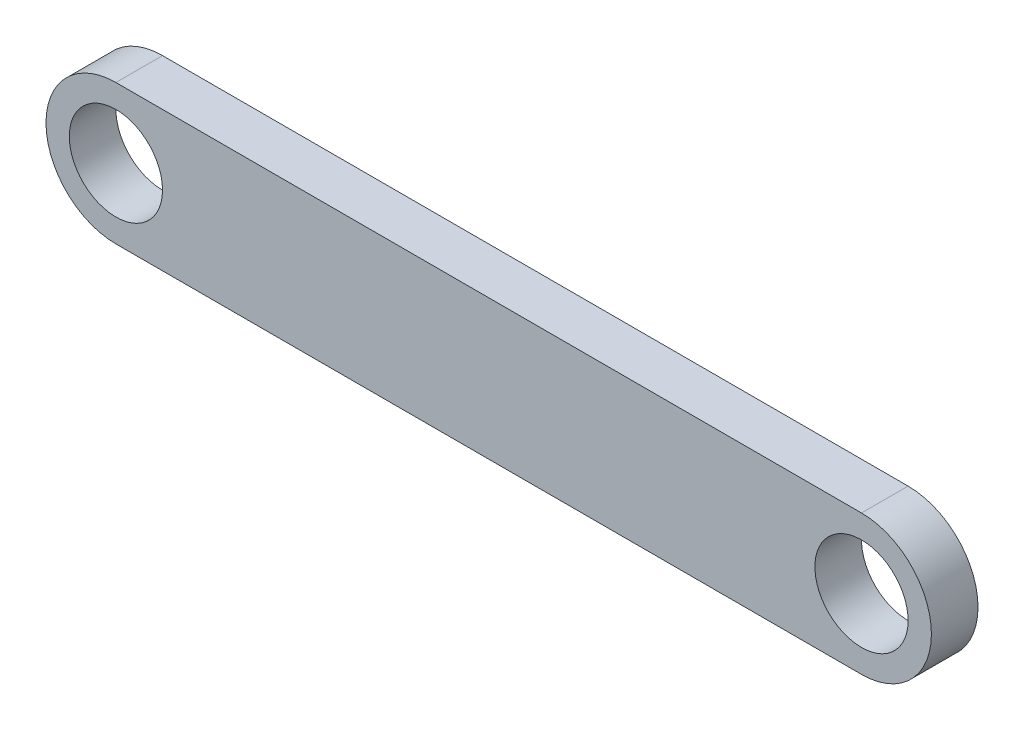
ISO-10303-21;
HEADER;
FILE_DESCRIPTION(('STEP AP214'),'2;1');
FILE_NAME('part.step','',(''),(''),'','','');
FILE_SCHEMA(('AUTOMOTIVE_DESIGN { 1 0 10303 214 1 1 1 1 }'));
ENDSEC;
DATA;
#1=APPLICATION_CONTEXT('core data for automotive mechanical design processes');
#2=APPLICATION_PROTOCOL_DEFINITION('international standard','automotive_design',2000,#1);
#3=PRODUCT_CONTEXT('',#1,'mechanical');
#4=PRODUCT('Part','Part','',(#3));
#5=PRODUCT_RELATED_PRODUCT_CATEGORY('part','',(#4));
#6=PRODUCT_DEFINITION_FORMATION('','',#4);
#7=PRODUCT_DEFINITION_CONTEXT('part definition',#1,'design');
#8=PRODUCT_DEFINITION('design','',#6,#7);
#9=PRODUCT_DEFINITION_SHAPE('','',#8);
#10=(LENGTH_UNIT() NAMED_UNIT(*) SI_UNIT(.MILLI.,.METRE.));
#11=(NAMED_UNIT(*) PLANE_ANGLE_UNIT() SI_UNIT($,.RADIAN.));
#12=(NAMED_UNIT(*) SI_UNIT($,.STERADIAN.) SOLID_ANGLE_UNIT());
#13=UNCERTAINTY_MEASURE_WITH_UNIT(LENGTH_MEASURE(1.E-05),#10,'distance_accuracy_value','');
#14=(GEOMETRIC_REPRESENTATION_CONTEXT(3) GLOBAL_UNCERTAINTY_ASSIGNED_CONTEXT((#13)) GLOBAL_UNIT_ASSIGNED_CONTEXT((#10,
#11,#12)) REPRESENTATION_CONTEXT('',''));
#15=CARTESIAN_POINT('',(0.,0.,0.));
#16=DIRECTION('',(0.,0.,1.));
#17=DIRECTION('',(1.,0.,0.));
#18=AXIS2_PLACEMENT_3D('',#15,#16,#17);
#19=CARTESIAN_POINT('',(0.,0.,10.));
#20=DIRECTION('',(0.,0.,1.));
#21=DIRECTION('',(1.,0.,0.));
#22=AXIS2_PLACEMENT_3D('',#19,#20,#21);
#23=PLANE('',#22);
#24=CARTESIAN_POINT('',(0.,0.,10.));
#25=DIRECTION('',(0.,0.,1.));
#26=DIRECTION('',(1.,0.,0.));
#27=AXIS2_PLACEMENT_3D('',#24,#25,#26);
#28=CIRCLE('',#27,10.);
#29=CARTESIAN_POINT('',(10.,0.,10.));
#30=VERTEX_POINT('',#29);
#31=EDGE_CURVE('E118',#30,#30,#28,.T.);
#32=ORIENTED_EDGE('',*,*,#31,.F.);
#33=EDGE_LOOP('',(#32));
#34=FACE_BOUND('',#33,.T.);
#35=CARTESIAN_POINT('',(0.,0.,10.));
#36=DIRECTION('',(0.,0.,1.));
#37=DIRECTION('',(1.,0.,0.));
#38=AXIS2_PLACEMENT_3D('',#35,#36,#37);
#39=CIRCLE('',#38,15.);
#40=CARTESIAN_POINT('',(0.,15.,10.));
#41=VERTEX_POINT('',#40);
#42=CARTESIAN_POINT('',(0.,-15.,10.));
#43=VERTEX_POINT('',#42);
#44=EDGE_CURVE('E98',#41,#43,#39,.T.);
#45=ORIENTED_EDGE('',*,*,#44,.T.);
#46=DIRECTION('',(1.,0.,0.));
#47=VECTOR('',#46,1.);
#48=CARTESIAN_POINT('',(0.,-15.,10.));
#49=LINE('',#48,#47);
#50=CARTESIAN_POINT('',(160.,-15.,10.));
#51=VERTEX_POINT('',#50);
#52=EDGE_CURVE('E93',#43,#51,#49,.T.);
#53=ORIENTED_EDGE('',*,*,#52,.T.);
#54=CARTESIAN_POINT('',(160.,0.,10.));
#55=DIRECTION('',(0.,0.,1.));
#56=DIRECTION('',(1.,0.,0.));
#57=AXIS2_PLACEMENT_3D('',#54,#55,#56);
#58=CIRCLE('',#57,15.);
#59=CARTESIAN_POINT('',(160.,15.,10.));
#60=VERTEX_POINT('',#59);
#61=EDGE_CURVE('E96',#51,#60,#58,.T.);
#62=ORIENTED_EDGE('',*,*,#61,.T.);
#63=DIRECTION('',(-1.,0.,0.));
#64=VECTOR('',#63,1.);
#65=CARTESIAN_POINT('',(0.,15.,10.));
#66=LINE('',#65,#64);
#67=EDGE_CURVE('E63',#60,#41,#66,.T.);
#68=ORIENTED_EDGE('',*,*,#67,.T.);
#69=EDGE_LOOP('',(#45,#53,#62,#68));
#70=FACE_BOUND('',#69,.T.);
#71=CARTESIAN_POINT('',(160.,0.,10.));
#72=DIRECTION('',(0.,0.,1.));
#73=DIRECTION('',(1.,0.,0.));
#74=AXIS2_PLACEMENT_3D('',#71,#72,#73);
#75=CIRCLE('',#74,10.);
#76=CARTESIAN_POINT('',(170.,0.,10.));
#77=VERTEX_POINT('',#76);
#78=EDGE_CURVE('E140',#77,#77,#75,.T.);
#79=ORIENTED_EDGE('',*,*,#78,.F.);
#80=EDGE_LOOP('',(#79));
#81=FACE_BOUND('',#80,.T.);
#82=ADVANCED_FACE('F45',(#34,#70,#81),#23,.T.);
#83=CARTESIAN_POINT('',(0.,0.,0.));
#84=DIRECTION('',(0.,0.,1.));
#85=DIRECTION('',(1.,0.,0.));
#86=AXIS2_PLACEMENT_3D('',#83,#84,#85);
#87=PLANE('',#86);
#88=CARTESIAN_POINT('',(0.,0.,0.));
#89=DIRECTION('',(0.,0.,1.));
#90=DIRECTION('',(1.,0.,0.));
#91=AXIS2_PLACEMENT_3D('',#88,#89,#90);
#92=CIRCLE('',#91,15.);
#93=CARTESIAN_POINT('',(0.,15.,0.));
#94=VERTEX_POINT('',#93);
#95=CARTESIAN_POINT('',(0.,-15.,0.));
#96=VERTEX_POINT('',#95);
#97=EDGE_CURVE('E114',#94,#96,#92,.T.);
#98=ORIENTED_EDGE('',*,*,#97,.F.);
#99=DIRECTION('',(-1.,0.,0.));
#100=VECTOR('',#99,1.);
#101=CARTESIAN_POINT('',(0.,15.,0.));
#102=LINE('',#101,#100);
#103=CARTESIAN_POINT('',(160.,15.,0.));
#104=VERTEX_POINT('',#103);
#105=EDGE_CURVE('E86',#104,#94,#102,.T.);
#106=ORIENTED_EDGE('',*,*,#105,.F.);
#107=CARTESIAN_POINT('',(160.,0.,0.));
#108=DIRECTION('',(0.,0.,1.));
#109=DIRECTION('',(1.,0.,0.));
#110=AXIS2_PLACEMENT_3D('',#107,#108,#109);
#111=CIRCLE('',#110,15.);
#112=CARTESIAN_POINT('',(160.,-15.,0.));
#113=VERTEX_POINT('',#112);
#114=EDGE_CURVE('E80',#113,#104,#111,.T.);
#115=ORIENTED_EDGE('',*,*,#114,.F.);
#116=DIRECTION('',(1.,0.,0.));
#117=VECTOR('',#116,1.);
#118=CARTESIAN_POINT('',(0.,-15.,0.));
#119=LINE('',#118,#117);
#120=EDGE_CURVE('E103',#96,#113,#119,.T.);
#121=ORIENTED_EDGE('',*,*,#120,.F.);
#122=EDGE_LOOP('',(#98,#106,#115,#121));
#123=FACE_BOUND('',#122,.T.);
#124=CARTESIAN_POINT('',(0.,0.,0.));
#125=DIRECTION('',(0.,0.,1.));
#126=DIRECTION('',(1.,0.,0.));
#127=AXIS2_PLACEMENT_3D('',#124,#125,#126);
#128=CIRCLE('',#127,10.);
#129=CARTESIAN_POINT('',(10.,0.,0.));
#130=VERTEX_POINT('',#129);
#131=EDGE_CURVE('E136',#130,#130,#128,.T.);
#132=ORIENTED_EDGE('',*,*,#131,.T.);
#133=EDGE_LOOP('',(#132));
#134=FACE_BOUND('',#133,.T.);
#135=CARTESIAN_POINT('',(160.,0.,0.));
#136=DIRECTION('',(0.,0.,1.));
#137=DIRECTION('',(1.,0.,0.));
#138=AXIS2_PLACEMENT_3D('',#135,#136,#137);
#139=CIRCLE('',#138,10.);
#140=CARTESIAN_POINT('',(170.,0.,0.));
#141=VERTEX_POINT('',#140);
#142=EDGE_CURVE('E144',#141,#141,#139,.T.);
#143=ORIENTED_EDGE('',*,*,#142,.T.);
#144=EDGE_LOOP('',(#143));
#145=FACE_BOUND('',#144,.T.);
#146=ADVANCED_FACE('F131',(#123,#134,#145),#87,.F.);
#147=CARTESIAN_POINT('',(0.,0.,10.));
#148=DIRECTION('',(0.,0.,-1.));
#149=DIRECTION('',(-1.,0.,0.));
#150=AXIS2_PLACEMENT_3D('',#147,#148,#149);
#151=CYLINDRICAL_SURFACE('',#150,15.);
#152=ORIENTED_EDGE('',*,*,#97,.T.);
#153=DIRECTION('',(0.,0.,-1.));
#154=VECTOR('',#153,1.);
#155=CARTESIAN_POINT('',(0.,-15.,10.));
#156=LINE('',#155,#154);
#157=EDGE_CURVE('E11',#43,#96,#156,.T.);
#158=ORIENTED_EDGE('',*,*,#157,.F.);
#159=ORIENTED_EDGE('',*,*,#44,.F.);
#160=DIRECTION('',(0.,0.,-1.));
#161=VECTOR('',#160,1.);
#162=CARTESIAN_POINT('',(0.,15.,10.));
#163=LINE('',#162,#161);
#164=EDGE_CURVE('E110',#41,#94,#163,.T.);
#165=ORIENTED_EDGE('',*,*,#164,.T.);
#166=EDGE_LOOP('',(#152,#158,#159,#165));
#167=FACE_BOUND('',#166,.T.);
#168=ADVANCED_FACE('F47',(#167),#151,.T.);
#169=CARTESIAN_POINT('',(0.,-15.,10.));
#170=DIRECTION('',(0.,1.,0.));
#171=DIRECTION('',(0.,0.,1.));
#172=AXIS2_PLACEMENT_3D('',#169,#170,#171);
#173=PLANE('',#172);
#174=ORIENTED_EDGE('',*,*,#120,.T.);
#175=DIRECTION('',(0.,0.,-1.));
#176=VECTOR('',#175,1.);
#177=CARTESIAN_POINT('',(160.,-15.,10.));
#178=LINE('',#177,#176);
#179=EDGE_CURVE('E55',#51,#113,#178,.T.);
#180=ORIENTED_EDGE('',*,*,#179,.F.);
#181=ORIENTED_EDGE('',*,*,#52,.F.);
#182=ORIENTED_EDGE('',*,*,#157,.T.);
#183=EDGE_LOOP('',(#174,#180,#181,#182));
#184=FACE_BOUND('',#183,.T.);
#185=ADVANCED_FACE('F102',(#184),#173,.F.);
#186=CARTESIAN_POINT('',(160.,0.,10.));
#187=DIRECTION('',(0.,0.,-1.));
#188=DIRECTION('',(-1.,0.,0.));
#189=AXIS2_PLACEMENT_3D('',#186,#187,#188);
#190=CYLINDRICAL_SURFACE('',#189,15.);
#191=ORIENTED_EDGE('',*,*,#114,.T.);
#192=DIRECTION('',(0.,0.,-1.));
#193=VECTOR('',#192,1.);
#194=CARTESIAN_POINT('',(160.,15.,10.));
#195=LINE('',#194,#193);
#196=EDGE_CURVE('E105',#60,#104,#195,.T.);
#197=ORIENTED_EDGE('',*,*,#196,.F.);
#198=ORIENTED_EDGE('',*,*,#61,.F.);
#199=ORIENTED_EDGE('',*,*,#179,.T.);
#200=EDGE_LOOP('',(#191,#197,#198,#199));
#201=FACE_BOUND('',#200,.T.);
#202=ADVANCED_FACE('F106',(#201),#190,.T.);
#203=CARTESIAN_POINT('',(0.,15.,10.));
#204=DIRECTION('',(0.,-1.,0.));
#205=DIRECTION('',(0.,0.,-1.));
#206=AXIS2_PLACEMENT_3D('',#203,#204,#205);
#207=PLANE('',#206);
#208=ORIENTED_EDGE('',*,*,#105,.T.);
#209=ORIENTED_EDGE('',*,*,#164,.F.);
#210=ORIENTED_EDGE('',*,*,#67,.F.);
#211=ORIENTED_EDGE('',*,*,#196,.T.);
#212=EDGE_LOOP('',(#208,#209,#210,#211));
#213=FACE_BOUND('',#212,.T.);
#214=ADVANCED_FACE('F128',(#213),#207,.F.);
#215=CARTESIAN_POINT('',(0.,0.,10.));
#216=DIRECTION('',(0.,0.,-1.));
#217=DIRECTION('',(-1.,0.,0.));
#218=AXIS2_PLACEMENT_3D('',#215,#216,#217);
#219=CYLINDRICAL_SURFACE('',#218,10.);
#220=ORIENTED_EDGE('',*,*,#31,.T.);
#221=EDGE_LOOP('',(#220));
#222=FACE_BOUND('',#221,.T.);
#223=ORIENTED_EDGE('',*,*,#131,.F.);
#224=EDGE_LOOP('',(#223));
#225=FACE_BOUND('',#224,.T.);
#226=ADVANCED_FACE('F163',(#222,#225),#219,.F.);
#227=CARTESIAN_POINT('',(160.,0.,10.));
#228=DIRECTION('',(0.,0.,-1.));
#229=DIRECTION('',(-1.,0.,0.));
#230=AXIS2_PLACEMENT_3D('',#227,#228,#229);
#231=CYLINDRICAL_SURFACE('',#230,10.);
#232=ORIENTED_EDGE('',*,*,#78,.T.);
#233=EDGE_LOOP('',(#232));
#234=FACE_BOUND('',#233,.T.);
#235=ORIENTED_EDGE('',*,*,#142,.F.);
#236=EDGE_LOOP('',(#235));
#237=FACE_BOUND('',#236,.T.);
#238=ADVANCED_FACE('F152',(#234,#237),#231,.F.);
#239=CLOSED_SHELL('',(#82,#146,#168,#185,#202,#214,#226,#238));
#240=MANIFOLD_SOLID_BREP('B2',#239);
#241=ADVANCED_BREP_SHAPE_REPRESENTATION('',(#18,#240),#14);
#242=SHAPE_DEFINITION_REPRESENTATION(#9,#241);
ENDSEC;
END-ISO-10303-21;
